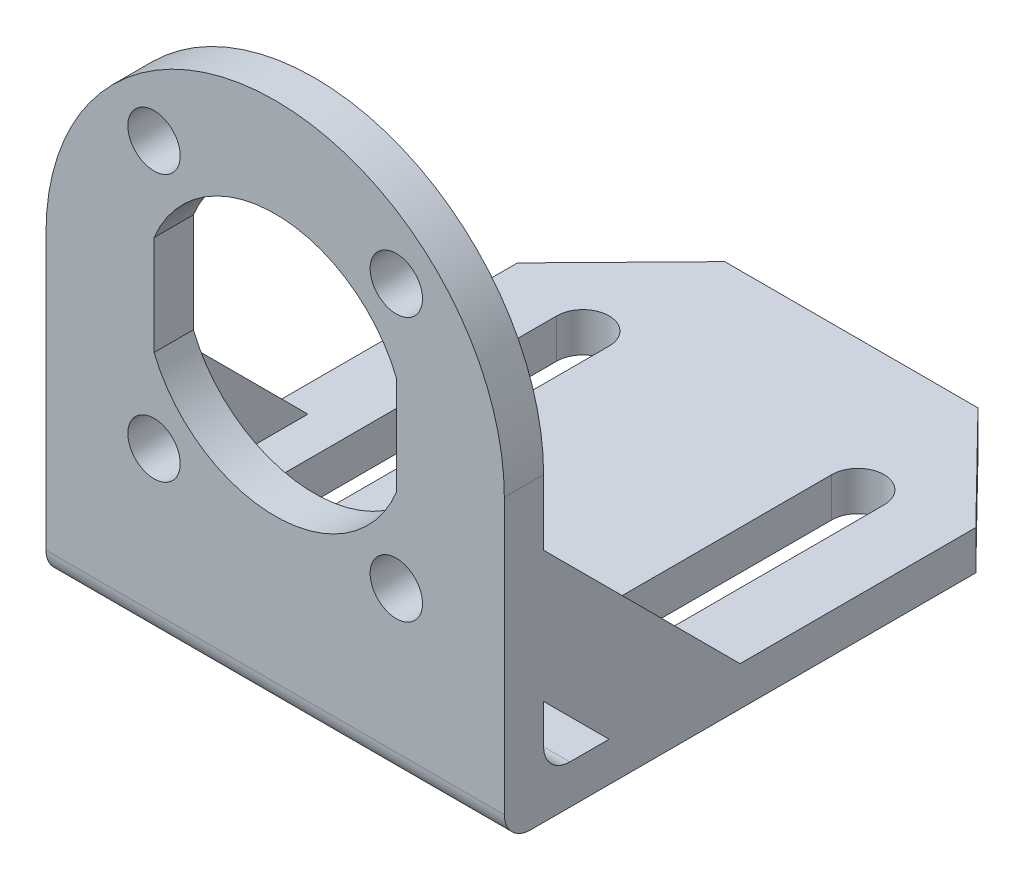
ISO-10303-21;
HEADER;
FILE_DESCRIPTION(('STEP AP214'),'2;1');
FILE_NAME('part.step','',(''),(''),'','','');
FILE_SCHEMA(('AUTOMOTIVE_DESIGN { 1 0 10303 214 1 1 1 1 }'));
ENDSEC;
DATA;
#1=APPLICATION_CONTEXT('core data for automotive mechanical design processes');
#2=APPLICATION_PROTOCOL_DEFINITION('international standard','automotive_design',2000,#1);
#3=PRODUCT_CONTEXT('',#1,'mechanical');
#4=PRODUCT('Part','Part','',(#3));
#5=PRODUCT_RELATED_PRODUCT_CATEGORY('part','',(#4));
#6=PRODUCT_DEFINITION_FORMATION('','',#4);
#7=PRODUCT_DEFINITION_CONTEXT('part definition',#1,'design');
#8=PRODUCT_DEFINITION('design','',#6,#7);
#9=PRODUCT_DEFINITION_SHAPE('','',#8);
#10=(LENGTH_UNIT() NAMED_UNIT(*) SI_UNIT(.MILLI.,.METRE.));
#11=(NAMED_UNIT(*) PLANE_ANGLE_UNIT() SI_UNIT($,.RADIAN.));
#12=(NAMED_UNIT(*) SI_UNIT($,.STERADIAN.) SOLID_ANGLE_UNIT());
#13=UNCERTAINTY_MEASURE_WITH_UNIT(LENGTH_MEASURE(1.E-05),#10,'distance_accuracy_value','');
#14=(GEOMETRIC_REPRESENTATION_CONTEXT(3) GLOBAL_UNCERTAINTY_ASSIGNED_CONTEXT((#13)) GLOBAL_UNIT_ASSIGNED_CONTEXT((#10,
#11,#12)) REPRESENTATION_CONTEXT('',''));
#15=CARTESIAN_POINT('',(0.,0.,0.));
#16=DIRECTION('',(0.,0.,1.));
#17=DIRECTION('',(1.,0.,0.));
#18=AXIS2_PLACEMENT_3D('',#15,#16,#17);
#19=CARTESIAN_POINT('',(17.5,20.,-1.5));
#20=DIRECTION('',(0.,0.,1.));
#21=DIRECTION('',(1.,0.,0.));
#22=AXIS2_PLACEMENT_3D('',#19,#20,#21);
#23=PLANE('',#22);
#24=CARTESIAN_POINT('',(26.7499999999999,9.85000000000002,-1.5));
#25=DIRECTION('',(0.,0.,1.));
#26=DIRECTION('',(1.,0.,0.));
#27=AXIS2_PLACEMENT_3D('',#24,#25,#26);
#28=CIRCLE('',#27,2.);
#29=CARTESIAN_POINT('',(28.75,9.85000000000002,-1.5));
#30=VERTEX_POINT('',#29);
#31=EDGE_CURVE('E274',#30,#30,#28,.T.);
#32=ORIENTED_EDGE('',*,*,#31,.T.);
#33=EDGE_LOOP('',(#32));
#34=FACE_BOUND('',#33,.T.);
#35=CARTESIAN_POINT('',(8.24999999999995,9.85000000000002,-1.5));
#36=DIRECTION('',(0.,0.,1.));
#37=DIRECTION('',(1.,0.,0.));
#38=AXIS2_PLACEMENT_3D('',#35,#36,#37);
#39=CIRCLE('',#38,2.);
#40=CARTESIAN_POINT('',(10.25,9.85000000000002,-1.5));
#41=VERTEX_POINT('',#40);
#42=EDGE_CURVE('E273',#41,#41,#39,.T.);
#43=ORIENTED_EDGE('',*,*,#42,.T.);
#44=EDGE_LOOP('',(#43));
#45=FACE_BOUND('',#44,.T.);
#46=CARTESIAN_POINT('',(26.75,30.,-1.5));
#47=DIRECTION('',(0.,0.,1.));
#48=DIRECTION('',(1.,0.,0.));
#49=AXIS2_PLACEMENT_3D('',#46,#47,#48);
#50=CIRCLE('',#49,2.);
#51=CARTESIAN_POINT('',(28.75,30.,-1.5));
#52=VERTEX_POINT('',#51);
#53=EDGE_CURVE('E281',#52,#52,#50,.T.);
#54=ORIENTED_EDGE('',*,*,#53,.T.);
#55=EDGE_LOOP('',(#54));
#56=FACE_BOUND('',#55,.T.);
#57=CARTESIAN_POINT('',(8.24996261537656,30.2018234548117,-1.5));
#58=DIRECTION('',(0.,0.,1.));
#59=DIRECTION('',(1.,0.,0.));
#60=AXIS2_PLACEMENT_3D('',#57,#58,#59);
#61=CIRCLE('',#60,2.);
#62=CARTESIAN_POINT('',(10.2499626153766,30.2018234548117,-1.5));
#63=VERTEX_POINT('',#62);
#64=EDGE_CURVE('E287',#63,#63,#61,.T.);
#65=ORIENTED_EDGE('',*,*,#64,.T.);
#66=EDGE_LOOP('',(#65));
#67=FACE_BOUND('',#66,.T.);
#68=CARTESIAN_POINT('',(17.5,20.,-1.5));
#69=DIRECTION('',(0.,0.,1.));
#70=DIRECTION('',(-1.,0.,0.));
#71=AXIS2_PLACEMENT_3D('',#68,#69,#70);
#72=CIRCLE('',#71,10.);
#73=CARTESIAN_POINT('',(26.75,23.7996710383927,-1.5));
#74=VERTEX_POINT('',#73);
#75=CARTESIAN_POINT('',(8.24999999999995,23.7996710383927,-1.5));
#76=VERTEX_POINT('',#75);
#77=EDGE_CURVE('E293',#74,#76,#72,.T.);
#78=ORIENTED_EDGE('',*,*,#77,.T.);
#79=DIRECTION('',(0.,-1.,0.));
#80=VECTOR('',#79,1.);
#81=CARTESIAN_POINT('',(8.24999999999995,23.7996710383927,-1.5));
#82=LINE('',#81,#80);
#83=CARTESIAN_POINT('',(8.24999999999995,16.2003289616073,-1.5));
#84=VERTEX_POINT('',#83);
#85=EDGE_CURVE('E309',#76,#84,#82,.T.);
#86=ORIENTED_EDGE('',*,*,#85,.T.);
#87=CARTESIAN_POINT('',(17.5,20.,-1.5));
#88=DIRECTION('',(0.,0.,1.));
#89=DIRECTION('',(1.,0.,0.));
#90=AXIS2_PLACEMENT_3D('',#87,#88,#89);
#91=CIRCLE('',#90,10.);
#92=CARTESIAN_POINT('',(26.75,16.2003289616073,-1.5));
#93=VERTEX_POINT('',#92);
#94=EDGE_CURVE('E312',#84,#93,#91,.T.);
#95=ORIENTED_EDGE('',*,*,#94,.T.);
#96=DIRECTION('',(0.,1.,0.));
#97=VECTOR('',#96,1.);
#98=CARTESIAN_POINT('',(26.75,23.7996710383927,-1.5));
#99=LINE('',#98,#97);
#100=EDGE_CURVE('E299',#93,#74,#99,.T.);
#101=ORIENTED_EDGE('',*,*,#100,.T.);
#102=EDGE_LOOP('',(#78,#86,#95,#101));
#103=FACE_BOUND('',#102,.T.);
#104=DIRECTION('',(0.,1.,0.));
#105=VECTOR('',#104,1.);
#106=CARTESIAN_POINT('',(35.,0.,-1.5));
#107=LINE('',#106,#105);
#108=CARTESIAN_POINT('',(35.,2.,-1.5));
#109=VERTEX_POINT('',#108);
#110=CARTESIAN_POINT('',(35.,5.,-1.5));
#111=VERTEX_POINT('',#110);
#112=EDGE_CURVE('E340',#109,#111,#107,.T.);
#113=ORIENTED_EDGE('',*,*,#112,.F.);
#114=DIRECTION('',(1.,0.,0.));
#115=VECTOR('',#114,1.);
#116=CARTESIAN_POINT('',(17.5,2.,-1.5));
#117=LINE('',#116,#115);
#118=CARTESIAN_POINT('',(0.,2.,-1.5));
#119=VERTEX_POINT('',#118);
#120=EDGE_CURVE('E351',#109,#119,#117,.F.);
#121=ORIENTED_EDGE('',*,*,#120,.T.);
#122=DIRECTION('',(0.,-1.,0.));
#123=VECTOR('',#122,1.);
#124=CARTESIAN_POINT('',(0.,20.,-1.5));
#125=LINE('',#124,#123);
#126=CARTESIAN_POINT('',(0.,5.,-1.5));
#127=VERTEX_POINT('',#126);
#128=EDGE_CURVE('E326',#127,#119,#125,.T.);
#129=ORIENTED_EDGE('',*,*,#128,.F.);
#130=DIRECTION('',(-1.,0.,0.));
#131=VECTOR('',#130,1.);
#132=CARTESIAN_POINT('',(2.00000000000002,4.99999999999999,-1.5));
#133=LINE('',#132,#131);
#134=CARTESIAN_POINT('',(2.00000000000002,4.99999999999999,-1.5));
#135=VERTEX_POINT('',#134);
#136=EDGE_CURVE('E420',#135,#127,#133,.T.);
#137=ORIENTED_EDGE('',*,*,#136,.F.);
#138=DIRECTION('',(0.,-1.,0.));
#139=VECTOR('',#138,1.);
#140=CARTESIAN_POINT('',(2.00000000000007,15.,-1.5));
#141=LINE('',#140,#139);
#142=CARTESIAN_POINT('',(2.00000000000007,15.,-1.5));
#143=VERTEX_POINT('',#142);
#144=EDGE_CURVE('E418',#143,#135,#141,.T.);
#145=ORIENTED_EDGE('',*,*,#144,.F.);
#146=DIRECTION('',(-1.,0.,0.));
#147=VECTOR('',#146,1.);
#148=CARTESIAN_POINT('',(2.00000000000007,15.,-1.5));
#149=LINE('',#148,#147);
#150=CARTESIAN_POINT('',(0.,15.,-1.5));
#151=VERTEX_POINT('',#150);
#152=EDGE_CURVE('E406',#143,#151,#149,.T.);
#153=ORIENTED_EDGE('',*,*,#152,.T.);
#154=CARTESIAN_POINT('',(0.,20.,-1.5));
#155=VERTEX_POINT('',#154);
#156=EDGE_CURVE('E336',#155,#151,#125,.T.);
#157=ORIENTED_EDGE('',*,*,#156,.F.);
#158=CARTESIAN_POINT('',(17.5,20.,-1.5));
#159=DIRECTION('',(0.,0.,1.));
#160=DIRECTION('',(1.,0.,0.));
#161=AXIS2_PLACEMENT_3D('',#158,#159,#160);
#162=CIRCLE('',#161,17.5);
#163=CARTESIAN_POINT('',(34.9999999999999,20.0000000000001,-1.5));
#164=VERTEX_POINT('',#163);
#165=EDGE_CURVE('E331',#164,#155,#162,.T.);
#166=ORIENTED_EDGE('',*,*,#165,.F.);
#167=CARTESIAN_POINT('',(34.9999999999999,15.,-1.5));
#168=VERTEX_POINT('',#167);
#169=EDGE_CURVE('E339',#168,#164,#107,.T.);
#170=ORIENTED_EDGE('',*,*,#169,.F.);
#171=DIRECTION('',(1.,0.,0.));
#172=VECTOR('',#171,1.);
#173=CARTESIAN_POINT('',(32.9999999999999,15.,-1.5));
#174=LINE('',#173,#172);
#175=CARTESIAN_POINT('',(32.9999999999999,15.,-1.5));
#176=VERTEX_POINT('',#175);
#177=EDGE_CURVE('E391',#176,#168,#174,.T.);
#178=ORIENTED_EDGE('',*,*,#177,.F.);
#179=DIRECTION('',(0.,-1.,0.));
#180=VECTOR('',#179,1.);
#181=CARTESIAN_POINT('',(32.9999999999999,15.,-1.5));
#182=LINE('',#181,#180);
#183=CARTESIAN_POINT('',(33.,4.99999999999999,-1.5));
#184=VERTEX_POINT('',#183);
#185=EDGE_CURVE('E411',#176,#184,#182,.T.);
#186=ORIENTED_EDGE('',*,*,#185,.T.);
#187=DIRECTION('',(1.,0.,0.));
#188=VECTOR('',#187,1.);
#189=CARTESIAN_POINT('',(33.,4.99999999999999,-1.5));
#190=LINE('',#189,#188);
#191=EDGE_CURVE('E371',#184,#111,#190,.T.);
#192=ORIENTED_EDGE('',*,*,#191,.T.);
#193=EDGE_LOOP('',(#113,#121,#129,#137,#145,#153,#157,#166,#170,#178,#186,#192));
#194=FACE_BOUND('',#193,.T.);
#195=ADVANCED_FACE('F43',(#34,#45,#56,#67,#103,#194),#23,.F.);
#196=CARTESIAN_POINT('',(0.,0.,-42.5));
#197=DIRECTION('',(0.,1.,0.));
#198=DIRECTION('',(0.,0.,1.));
#199=AXIS2_PLACEMENT_3D('',#196,#197,#198);
#200=PLANE('',#199);
#201=DIRECTION('',(0.,0.,1.));
#202=VECTOR('',#201,1.);
#203=CARTESIAN_POINT('',(0.,0.,-42.5));
#204=LINE('',#203,#202);
#205=CARTESIAN_POINT('',(0.,0.,-6.5));
#206=VERTEX_POINT('',#205);
#207=CARTESIAN_POINT('',(0.,0.,-3.5));
#208=VERTEX_POINT('',#207);
#209=EDGE_CURVE('E378',#206,#208,#204,.T.);
#210=ORIENTED_EDGE('',*,*,#209,.T.);
#211=DIRECTION('',(1.,0.,0.));
#212=VECTOR('',#211,1.);
#213=CARTESIAN_POINT('',(0.,0.,-3.5));
#214=LINE('',#213,#212);
#215=CARTESIAN_POINT('',(35.,0.,-3.5));
#216=VERTEX_POINT('',#215);
#217=EDGE_CURVE('E348',#208,#216,#214,.T.);
#218=ORIENTED_EDGE('',*,*,#217,.T.);
#219=DIRECTION('',(0.,0.,1.));
#220=VECTOR('',#219,1.);
#221=CARTESIAN_POINT('',(35.,0.,-42.5));
#222=LINE('',#221,#220);
#223=CARTESIAN_POINT('',(35.,0.,-6.5));
#224=VERTEX_POINT('',#223);
#225=EDGE_CURVE('E260',#224,#216,#222,.T.);
#226=ORIENTED_EDGE('',*,*,#225,.F.);
#227=DIRECTION('',(1.,0.,0.));
#228=VECTOR('',#227,1.);
#229=CARTESIAN_POINT('',(33.,0.,-6.5));
#230=LINE('',#229,#228);
#231=CARTESIAN_POINT('',(33.,0.,-6.5));
#232=VERTEX_POINT('',#231);
#233=EDGE_CURVE('E396',#232,#224,#230,.T.);
#234=ORIENTED_EDGE('',*,*,#233,.F.);
#235=DIRECTION('',(0.,0.,-1.));
#236=VECTOR('',#235,1.);
#237=CARTESIAN_POINT('',(33.,0.,-6.5));
#238=LINE('',#237,#236);
#239=CARTESIAN_POINT('',(33.,0.,-16.5));
#240=VERTEX_POINT('',#239);
#241=EDGE_CURVE('E394',#232,#240,#238,.T.);
#242=ORIENTED_EDGE('',*,*,#241,.T.);
#243=DIRECTION('',(1.,0.,0.));
#244=VECTOR('',#243,1.);
#245=CARTESIAN_POINT('',(33.,0.,-16.5));
#246=LINE('',#245,#244);
#247=CARTESIAN_POINT('',(35.,0.,-16.5));
#248=VERTEX_POINT('',#247);
#249=EDGE_CURVE('E390',#240,#248,#246,.T.);
#250=ORIENTED_EDGE('',*,*,#249,.T.);
#251=CARTESIAN_POINT('',(35.,0.,-34.5));
#252=VERTEX_POINT('',#251);
#253=EDGE_CURVE('E264',#252,#248,#222,.T.);
#254=ORIENTED_EDGE('',*,*,#253,.F.);
#255=DIRECTION('',(0.699472755302858,0.,0.71465926467725));
#256=VECTOR('',#255,1.);
#257=CARTESIAN_POINT('',(35.1218468919606,0.,-34.3755076455064));
#258=LINE('',#257,#256);
#259=CARTESIAN_POINT('',(27.17,0.,-42.5));
#260=VERTEX_POINT('',#259);
#261=EDGE_CURVE('E246',#260,#252,#258,.T.);
#262=ORIENTED_EDGE('',*,*,#261,.F.);
#263=DIRECTION('',(-1.,0.,0.));
#264=VECTOR('',#263,1.);
#265=CARTESIAN_POINT('',(0.,0.,-42.5));
#266=LINE('',#265,#264);
#267=CARTESIAN_POINT('',(7.83,0.,-42.5));
#268=VERTEX_POINT('',#267);
#269=EDGE_CURVE('E266',#260,#268,#266,.T.);
#270=ORIENTED_EDGE('',*,*,#269,.T.);
#271=DIRECTION('',(0.699472755302858,0.,-0.71465926467725));
#272=VECTOR('',#271,1.);
#273=CARTESIAN_POINT('',(-17.2460216313446,0.,-16.8795436716785));
#274=LINE('',#273,#272);
#275=CARTESIAN_POINT('',(0.,0.,-34.5));
#276=VERTEX_POINT('',#275);
#277=EDGE_CURVE('E477',#276,#268,#274,.T.);
#278=ORIENTED_EDGE('',*,*,#277,.F.);
#279=CARTESIAN_POINT('',(0.,0.,-16.5));
#280=VERTEX_POINT('',#279);
#281=EDGE_CURVE('E277',#276,#280,#204,.T.);
#282=ORIENTED_EDGE('',*,*,#281,.T.);
#283=DIRECTION('',(-1.,0.,0.));
#284=VECTOR('',#283,1.);
#285=CARTESIAN_POINT('',(2.,0.,-16.5));
#286=LINE('',#285,#284);
#287=CARTESIAN_POINT('',(2.,0.,-16.5));
#288=VERTEX_POINT('',#287);
#289=EDGE_CURVE('E415',#288,#280,#286,.T.);
#290=ORIENTED_EDGE('',*,*,#289,.F.);
#291=DIRECTION('',(0.,0.,-1.));
#292=VECTOR('',#291,1.);
#293=CARTESIAN_POINT('',(2.,0.,-6.5));
#294=LINE('',#293,#292);
#295=CARTESIAN_POINT('',(2.,0.,-6.49999999999999));
#296=VERTEX_POINT('',#295);
#297=EDGE_CURVE('E435',#296,#288,#294,.T.);
#298=ORIENTED_EDGE('',*,*,#297,.F.);
#299=DIRECTION('',(-1.,0.,0.));
#300=VECTOR('',#299,1.);
#301=CARTESIAN_POINT('',(2.,0.,-6.5));
#302=LINE('',#301,#300);
#303=EDGE_CURVE('E384',#296,#206,#302,.T.);
#304=ORIENTED_EDGE('',*,*,#303,.T.);
#305=EDGE_LOOP('',(#210,#218,#226,#234,#242,#250,#254,#262,#270,#278,#282,#290,#298,#304));
#306=FACE_BOUND('',#305,.T.);
#307=DIRECTION('',(0.,0.,1.));
#308=VECTOR('',#307,1.);
#309=CARTESIAN_POINT('',(26.,0.,0.));
#310=LINE('',#309,#308);
#311=CARTESIAN_POINT('',(26.,0.,-32.5));
#312=VERTEX_POINT('',#311);
#313=CARTESIAN_POINT('',(26.,0.,-10.5));
#314=VERTEX_POINT('',#313);
#315=EDGE_CURVE('E248',#312,#314,#310,.T.);
#316=ORIENTED_EDGE('',*,*,#315,.F.);
#317=CARTESIAN_POINT('',(28.,0.,-32.5));
#318=DIRECTION('',(0.,1.,0.));
#319=DIRECTION('',(0.,0.,1.));
#320=AXIS2_PLACEMENT_3D('',#317,#318,#319);
#321=CIRCLE('',#320,1.99999999999999);
#322=CARTESIAN_POINT('',(30.,0.,-32.5));
#323=VERTEX_POINT('',#322);
#324=EDGE_CURVE('E489',#323,#312,#321,.T.);
#325=ORIENTED_EDGE('',*,*,#324,.F.);
#326=DIRECTION('',(0.,0.,1.));
#327=VECTOR('',#326,1.);
#328=CARTESIAN_POINT('',(30.,0.,0.));
#329=LINE('',#328,#327);
#330=CARTESIAN_POINT('',(30.,0.,-10.5));
#331=VERTEX_POINT('',#330);
#332=EDGE_CURVE('E493',#323,#331,#329,.T.);
#333=ORIENTED_EDGE('',*,*,#332,.T.);
#334=CARTESIAN_POINT('',(28.,0.,-10.5));
#335=DIRECTION('',(0.,1.,0.));
#336=DIRECTION('',(0.,0.,1.));
#337=AXIS2_PLACEMENT_3D('',#334,#335,#336);
#338=CIRCLE('',#337,2.);
#339=EDGE_CURVE('E496',#314,#331,#338,.T.);
#340=ORIENTED_EDGE('',*,*,#339,.F.);
#341=EDGE_LOOP('',(#316,#325,#333,#340));
#342=FACE_BOUND('',#341,.T.);
#343=DIRECTION('',(0.,0.,1.));
#344=VECTOR('',#343,1.);
#345=CARTESIAN_POINT('',(5.,0.,0.));
#346=LINE('',#345,#344);
#347=CARTESIAN_POINT('',(5.,0.,-32.5));
#348=VERTEX_POINT('',#347);
#349=CARTESIAN_POINT('',(5.,0.,-10.5));
#350=VERTEX_POINT('',#349);
#351=EDGE_CURVE('E458',#348,#350,#346,.T.);
#352=ORIENTED_EDGE('',*,*,#351,.F.);
#353=CARTESIAN_POINT('',(7.,0.,-32.5));
#354=DIRECTION('',(0.,1.,0.));
#355=DIRECTION('',(0.,0.,1.));
#356=AXIS2_PLACEMENT_3D('',#353,#354,#355);
#357=CIRCLE('',#356,2.);
#358=CARTESIAN_POINT('',(9.,0.,-32.5));
#359=VERTEX_POINT('',#358);
#360=EDGE_CURVE('E448',#359,#348,#357,.T.);
#361=ORIENTED_EDGE('',*,*,#360,.F.);
#362=DIRECTION('',(0.,0.,1.));
#363=VECTOR('',#362,1.);
#364=CARTESIAN_POINT('',(8.99999999999999,0.,0.));
#365=LINE('',#364,#363);
#366=CARTESIAN_POINT('',(8.99999999999999,0.,-10.5));
#367=VERTEX_POINT('',#366);
#368=EDGE_CURVE('E452',#359,#367,#365,.T.);
#369=ORIENTED_EDGE('',*,*,#368,.T.);
#370=CARTESIAN_POINT('',(6.99999999999999,0.,-10.5));
#371=DIRECTION('',(0.,1.,0.));
#372=DIRECTION('',(0.,0.,1.));
#373=AXIS2_PLACEMENT_3D('',#370,#371,#372);
#374=CIRCLE('',#373,2.);
#375=EDGE_CURVE('E455',#350,#367,#374,.T.);
#376=ORIENTED_EDGE('',*,*,#375,.F.);
#377=EDGE_LOOP('',(#352,#361,#369,#376));
#378=FACE_BOUND('',#377,.T.);
#379=ADVANCED_FACE('F381',(#306,#342,#378),#200,.T.);
#380=CARTESIAN_POINT('',(17.5,20.,1.5));
#381=DIRECTION('',(0.,0.,1.));
#382=DIRECTION('',(1.,0.,0.));
#383=AXIS2_PLACEMENT_3D('',#380,#381,#382);
#384=PLANE('',#383);
#385=CARTESIAN_POINT('',(8.24999999999995,9.85000000000002,1.5));
#386=DIRECTION('',(0.,0.,1.));
#387=DIRECTION('',(1.,0.,0.));
#388=AXIS2_PLACEMENT_3D('',#385,#386,#387);
#389=CIRCLE('',#388,2.);
#390=CARTESIAN_POINT('',(10.25,9.85000000000002,1.5));
#391=VERTEX_POINT('',#390);
#392=EDGE_CURVE('E278',#391,#391,#389,.T.);
#393=ORIENTED_EDGE('',*,*,#392,.F.);
#394=EDGE_LOOP('',(#393));
#395=FACE_BOUND('',#394,.T.);
#396=CARTESIAN_POINT('',(8.24996261537656,30.2018234548117,1.5));
#397=DIRECTION('',(0.,0.,1.));
#398=DIRECTION('',(1.,0.,0.));
#399=AXIS2_PLACEMENT_3D('',#396,#397,#398);
#400=CIRCLE('',#399,2.);
#401=CARTESIAN_POINT('',(10.2499626153766,30.2018234548117,1.5));
#402=VERTEX_POINT('',#401);
#403=EDGE_CURVE('E290',#402,#402,#400,.T.);
#404=ORIENTED_EDGE('',*,*,#403,.F.);
#405=EDGE_LOOP('',(#404));
#406=FACE_BOUND('',#405,.T.);
#407=DIRECTION('',(0.,-1.,0.));
#408=VECTOR('',#407,1.);
#409=CARTESIAN_POINT('',(0.,20.,1.5));
#410=LINE('',#409,#408);
#411=CARTESIAN_POINT('',(0.,20.,1.5));
#412=VERTEX_POINT('',#411);
#413=CARTESIAN_POINT('',(0.,-1.,1.5));
#414=VERTEX_POINT('',#413);
#415=EDGE_CURVE('E327',#412,#414,#410,.T.);
#416=ORIENTED_EDGE('',*,*,#415,.T.);
#417=DIRECTION('',(1.,0.,0.));
#418=VECTOR('',#417,1.);
#419=CARTESIAN_POINT('',(17.5,-0.999999999999997,1.5));
#420=LINE('',#419,#418);
#421=CARTESIAN_POINT('',(35.,-0.999999999999995,1.5));
#422=VERTEX_POINT('',#421);
#423=EDGE_CURVE('E353',#414,#422,#420,.T.);
#424=ORIENTED_EDGE('',*,*,#423,.T.);
#425=DIRECTION('',(0.,1.,0.));
#426=VECTOR('',#425,1.);
#427=CARTESIAN_POINT('',(35.,0.,1.5));
#428=LINE('',#427,#426);
#429=CARTESIAN_POINT('',(34.9999999999999,20.0000000000001,1.5));
#430=VERTEX_POINT('',#429);
#431=EDGE_CURVE('E330',#422,#430,#428,.T.);
#432=ORIENTED_EDGE('',*,*,#431,.T.);
#433=CARTESIAN_POINT('',(17.5,20.,1.5));
#434=DIRECTION('',(0.,0.,1.));
#435=DIRECTION('',(1.,0.,0.));
#436=AXIS2_PLACEMENT_3D('',#433,#434,#435);
#437=CIRCLE('',#436,17.5);
#438=EDGE_CURVE('E333',#430,#412,#437,.T.);
#439=ORIENTED_EDGE('',*,*,#438,.T.);
#440=EDGE_LOOP('',(#416,#424,#432,#439));
#441=FACE_BOUND('',#440,.T.);
#442=DIRECTION('',(0.,-1.,0.));
#443=VECTOR('',#442,1.);
#444=CARTESIAN_POINT('',(8.24999999999995,23.7996710383927,1.5));
#445=LINE('',#444,#443);
#446=CARTESIAN_POINT('',(8.24999999999995,23.7996710383927,1.5));
#447=VERTEX_POINT('',#446);
#448=CARTESIAN_POINT('',(8.24999999999995,16.2003289616073,1.5));
#449=VERTEX_POINT('',#448);
#450=EDGE_CURVE('E298',#447,#449,#445,.T.);
#451=ORIENTED_EDGE('',*,*,#450,.F.);
#452=CARTESIAN_POINT('',(17.5,20.,1.5));
#453=DIRECTION('',(0.,0.,1.));
#454=DIRECTION('',(-1.,0.,0.));
#455=AXIS2_PLACEMENT_3D('',#452,#453,#454);
#456=CIRCLE('',#455,10.);
#457=CARTESIAN_POINT('',(26.75,23.7996710383927,1.5));
#458=VERTEX_POINT('',#457);
#459=EDGE_CURVE('E296',#458,#447,#456,.T.);
#460=ORIENTED_EDGE('',*,*,#459,.F.);
#461=DIRECTION('',(0.,1.,0.));
#462=VECTOR('',#461,1.);
#463=CARTESIAN_POINT('',(26.75,23.7996710383927,1.5));
#464=LINE('',#463,#462);
#465=CARTESIAN_POINT('',(26.75,16.2003289616073,1.5));
#466=VERTEX_POINT('',#465);
#467=EDGE_CURVE('E304',#466,#458,#464,.T.);
#468=ORIENTED_EDGE('',*,*,#467,.F.);
#469=CARTESIAN_POINT('',(17.5,20.,1.5));
#470=DIRECTION('',(0.,0.,1.));
#471=DIRECTION('',(1.,0.,0.));
#472=AXIS2_PLACEMENT_3D('',#469,#470,#471);
#473=CIRCLE('',#472,10.);
#474=EDGE_CURVE('E301',#449,#466,#473,.T.);
#475=ORIENTED_EDGE('',*,*,#474,.F.);
#476=EDGE_LOOP('',(#451,#460,#468,#475));
#477=FACE_BOUND('',#476,.T.);
#478=CARTESIAN_POINT('',(26.75,30.,1.5));
#479=DIRECTION('',(0.,0.,1.));
#480=DIRECTION('',(1.,0.,0.));
#481=AXIS2_PLACEMENT_3D('',#478,#479,#480);
#482=CIRCLE('',#481,2.);
#483=CARTESIAN_POINT('',(28.75,30.,1.5));
#484=VERTEX_POINT('',#483);
#485=EDGE_CURVE('E284',#484,#484,#482,.T.);
#486=ORIENTED_EDGE('',*,*,#485,.F.);
#487=EDGE_LOOP('',(#486));
#488=FACE_BOUND('',#487,.T.);
#489=CARTESIAN_POINT('',(26.7499999999999,9.85000000000002,1.5));
#490=DIRECTION('',(0.,0.,1.));
#491=DIRECTION('',(1.,0.,0.));
#492=AXIS2_PLACEMENT_3D('',#489,#490,#491);
#493=CIRCLE('',#492,2.);
#494=CARTESIAN_POINT('',(28.75,9.85000000000002,1.5));
#495=VERTEX_POINT('',#494);
#496=EDGE_CURVE('E270',#495,#495,#493,.T.);
#497=ORIENTED_EDGE('',*,*,#496,.F.);
#498=EDGE_LOOP('',(#497));
#499=FACE_BOUND('',#498,.T.);
#500=ADVANCED_FACE('F524',(#395,#406,#441,#477,#488,#499),#384,.T.);
#501=CARTESIAN_POINT('',(0.,20.,1.5));
#502=DIRECTION('',(1.,0.,0.));
#503=DIRECTION('',(0.,1.,0.));
#504=AXIS2_PLACEMENT_3D('',#501,#502,#503);
#505=PLANE('',#504);
#506=DIRECTION('',(0.,-0.707106781186548,-0.707106781186547));
#507=VECTOR('',#506,1.);
#508=CARTESIAN_POINT('',(0.,5.,-1.5));
#509=LINE('',#508,#507);
#510=EDGE_CURVE('E425',#127,#206,#509,.T.);
#511=ORIENTED_EDGE('',*,*,#510,.F.);
#512=ORIENTED_EDGE('',*,*,#128,.T.);
#513=CARTESIAN_POINT('',(0.,2.,-3.5));
#514=DIRECTION('',(1.,0.,0.));
#515=DIRECTION('',(0.,1.,0.));
#516=AXIS2_PLACEMENT_3D('',#513,#514,#515);
#517=CIRCLE('',#516,2.);
#518=EDGE_CURVE('E11',#119,#208,#517,.T.);
#519=ORIENTED_EDGE('',*,*,#518,.T.);
#520=ORIENTED_EDGE('',*,*,#209,.F.);
#521=EDGE_LOOP('',(#511,#512,#519,#520));
#522=FACE_BOUND('',#521,.T.);
#523=DIRECTION('',(0.,0.,1.));
#524=VECTOR('',#523,1.);
#525=CARTESIAN_POINT('',(0.,-3.,-42.5));
#526=LINE('',#525,#524);
#527=CARTESIAN_POINT('',(0.,-3.,-34.5));
#528=VERTEX_POINT('',#527);
#529=CARTESIAN_POINT('',(0.,-3.,-0.5));
#530=VERTEX_POINT('',#529);
#531=EDGE_CURVE('E261',#528,#530,#526,.T.);
#532=ORIENTED_EDGE('',*,*,#531,.T.);
#533=CARTESIAN_POINT('',(0.,-1.,-0.5));
#534=DIRECTION('',(1.,0.,0.));
#535=DIRECTION('',(0.,1.,0.));
#536=AXIS2_PLACEMENT_3D('',#533,#534,#535);
#537=CIRCLE('',#536,2.);
#538=EDGE_CURVE('E358',#530,#414,#537,.F.);
#539=ORIENTED_EDGE('',*,*,#538,.T.);
#540=ORIENTED_EDGE('',*,*,#415,.F.);
#541=DIRECTION('',(0.,0.,-1.));
#542=VECTOR('',#541,1.);
#543=CARTESIAN_POINT('',(0.,20.,1.5));
#544=LINE('',#543,#542);
#545=EDGE_CURVE('E335',#412,#155,#544,.T.);
#546=ORIENTED_EDGE('',*,*,#545,.T.);
#547=ORIENTED_EDGE('',*,*,#156,.T.);
#548=DIRECTION('',(0.,0.707106781186547,0.707106781186548));
#549=VECTOR('',#548,1.);
#550=CARTESIAN_POINT('',(0.,0.,-16.5));
#551=LINE('',#550,#549);
#552=EDGE_CURVE('E428',#280,#151,#551,.T.);
#553=ORIENTED_EDGE('',*,*,#552,.F.);
#554=ORIENTED_EDGE('',*,*,#281,.F.);
#555=DIRECTION('',(0.,1.,0.));
#556=VECTOR('',#555,1.);
#557=CARTESIAN_POINT('',(0.,-3.,-34.5));
#558=LINE('',#557,#556);
#559=EDGE_CURVE('E471',#528,#276,#558,.T.);
#560=ORIENTED_EDGE('',*,*,#559,.F.);
#561=EDGE_LOOP('',(#532,#539,#540,#546,#547,#553,#554,#560));
#562=FACE_BOUND('',#561,.T.);
#563=ADVANCED_FACE('F376',(#522,#562),#505,.F.);
#564=CARTESIAN_POINT('',(35.,0.,1.5));
#565=DIRECTION('',(-1.,0.,0.));
#566=DIRECTION('',(0.,-1.,0.));
#567=AXIS2_PLACEMENT_3D('',#564,#565,#566);
#568=PLANE('',#567);
#569=ORIENTED_EDGE('',*,*,#225,.T.);
#570=CARTESIAN_POINT('',(35.,2.,-3.5));
#571=DIRECTION('',(-1.,0.,0.));
#572=DIRECTION('',(0.,-1.,0.));
#573=AXIS2_PLACEMENT_3D('',#570,#571,#572);
#574=CIRCLE('',#573,2.);
#575=EDGE_CURVE('E51',#216,#109,#574,.T.);
#576=ORIENTED_EDGE('',*,*,#575,.T.);
#577=ORIENTED_EDGE('',*,*,#112,.T.);
#578=DIRECTION('',(0.,-0.707106781186548,-0.707106781186547));
#579=VECTOR('',#578,1.);
#580=CARTESIAN_POINT('',(35.,5.,-1.5));
#581=LINE('',#580,#579);
#582=EDGE_CURVE('E401',#111,#224,#581,.T.);
#583=ORIENTED_EDGE('',*,*,#582,.T.);
#584=EDGE_LOOP('',(#569,#576,#577,#583));
#585=FACE_BOUND('',#584,.T.);
#586=ORIENTED_EDGE('',*,*,#431,.F.);
#587=CARTESIAN_POINT('',(35.,-0.999999999999995,-0.5));
#588=DIRECTION('',(-1.,0.,0.));
#589=DIRECTION('',(0.,-1.,0.));
#590=AXIS2_PLACEMENT_3D('',#587,#588,#589);
#591=CIRCLE('',#590,2.);
#592=CARTESIAN_POINT('',(35.,-3.,-0.5));
#593=VERTEX_POINT('',#592);
#594=EDGE_CURVE('E66',#422,#593,#591,.F.);
#595=ORIENTED_EDGE('',*,*,#594,.T.);
#596=DIRECTION('',(0.,0.,1.));
#597=VECTOR('',#596,1.);
#598=CARTESIAN_POINT('',(35.,-3.,-42.5));
#599=LINE('',#598,#597);
#600=CARTESIAN_POINT('',(35.,-3.,-34.5));
#601=VERTEX_POINT('',#600);
#602=EDGE_CURVE('E254',#601,#593,#599,.T.);
#603=ORIENTED_EDGE('',*,*,#602,.F.);
#604=DIRECTION('',(0.,1.,0.));
#605=VECTOR('',#604,1.);
#606=CARTESIAN_POINT('',(35.,-3.,-34.5));
#607=LINE('',#606,#605);
#608=EDGE_CURVE('E240',#601,#252,#607,.T.);
#609=ORIENTED_EDGE('',*,*,#608,.T.);
#610=ORIENTED_EDGE('',*,*,#253,.T.);
#611=DIRECTION('',(0.,0.707106781186547,0.707106781186548));
#612=VECTOR('',#611,1.);
#613=CARTESIAN_POINT('',(35.,0.,-16.5));
#614=LINE('',#613,#612);
#615=EDGE_CURVE('E404',#248,#168,#614,.T.);
#616=ORIENTED_EDGE('',*,*,#615,.T.);
#617=ORIENTED_EDGE('',*,*,#169,.T.);
#618=DIRECTION('',(0.,0.,-1.));
#619=VECTOR('',#618,1.);
#620=CARTESIAN_POINT('',(34.9999999999999,20.0000000000001,1.5));
#621=LINE('',#620,#619);
#622=EDGE_CURVE('E345',#430,#164,#621,.T.);
#623=ORIENTED_EDGE('',*,*,#622,.F.);
#624=EDGE_LOOP('',(#586,#595,#603,#609,#610,#616,#617,#623));
#625=FACE_BOUND('',#624,.T.);
#626=ADVANCED_FACE('F259',(#585,#625),#568,.F.);
#627=CARTESIAN_POINT('',(17.5,20.,1.5));
#628=DIRECTION('',(0.,0.,-1.));
#629=DIRECTION('',(-1.,0.,0.));
#630=AXIS2_PLACEMENT_3D('',#627,#628,#629);
#631=CYLINDRICAL_SURFACE('',#630,17.5);
#632=ORIENTED_EDGE('',*,*,#165,.T.);
#633=ORIENTED_EDGE('',*,*,#545,.F.);
#634=ORIENTED_EDGE('',*,*,#438,.F.);
#635=ORIENTED_EDGE('',*,*,#622,.T.);
#636=EDGE_LOOP('',(#632,#633,#634,#635));
#637=FACE_BOUND('',#636,.T.);
#638=ADVANCED_FACE('F532',(#637),#631,.T.);
#639=CARTESIAN_POINT('',(17.5,20.,1.5));
#640=DIRECTION('',(0.,0.,-1.));
#641=DIRECTION('',(-1.,0.,0.));
#642=AXIS2_PLACEMENT_3D('',#639,#640,#641);
#643=CYLINDRICAL_SURFACE('',#642,10.);
#644=ORIENTED_EDGE('',*,*,#77,.F.);
#645=DIRECTION('',(0.,0.,-1.));
#646=VECTOR('',#645,1.);
#647=CARTESIAN_POINT('',(26.75,23.7996710383927,1.5));
#648=LINE('',#647,#646);
#649=EDGE_CURVE('E306',#458,#74,#648,.T.);
#650=ORIENTED_EDGE('',*,*,#649,.F.);
#651=ORIENTED_EDGE('',*,*,#459,.T.);
#652=DIRECTION('',(0.,0.,-1.));
#653=VECTOR('',#652,1.);
#654=CARTESIAN_POINT('',(8.24999999999995,23.7996710383927,1.5));
#655=LINE('',#654,#653);
#656=EDGE_CURVE('E323',#447,#76,#655,.T.);
#657=ORIENTED_EDGE('',*,*,#656,.T.);
#658=EDGE_LOOP('',(#644,#650,#651,#657));
#659=FACE_BOUND('',#658,.T.);
#660=ADVANCED_FACE('F569',(#659),#643,.F.);
#661=CARTESIAN_POINT('',(8.24999999999995,23.7996710383927,1.5));
#662=DIRECTION('',(1.,0.,0.));
#663=DIRECTION('',(0.,0.,-1.));
#664=AXIS2_PLACEMENT_3D('',#661,#662,#663);
#665=PLANE('',#664);
#666=ORIENTED_EDGE('',*,*,#85,.F.);
#667=ORIENTED_EDGE('',*,*,#656,.F.);
#668=ORIENTED_EDGE('',*,*,#450,.T.);
#669=DIRECTION('',(0.,0.,-1.));
#670=VECTOR('',#669,1.);
#671=CARTESIAN_POINT('',(8.24999999999995,16.2003289616073,1.5));
#672=LINE('',#671,#670);
#673=EDGE_CURVE('E321',#449,#84,#672,.T.);
#674=ORIENTED_EDGE('',*,*,#673,.T.);
#675=EDGE_LOOP('',(#666,#667,#668,#674));
#676=FACE_BOUND('',#675,.T.);
#677=ADVANCED_FACE('F653',(#676),#665,.T.);
#678=CARTESIAN_POINT('',(17.5,20.,1.5));
#679=DIRECTION('',(0.,0.,-1.));
#680=DIRECTION('',(-1.,0.,0.));
#681=AXIS2_PLACEMENT_3D('',#678,#679,#680);
#682=CYLINDRICAL_SURFACE('',#681,10.);
#683=ORIENTED_EDGE('',*,*,#94,.F.);
#684=ORIENTED_EDGE('',*,*,#673,.F.);
#685=ORIENTED_EDGE('',*,*,#474,.T.);
#686=DIRECTION('',(0.,0.,-1.));
#687=VECTOR('',#686,1.);
#688=CARTESIAN_POINT('',(26.75,16.2003289616073,1.5));
#689=LINE('',#688,#687);
#690=EDGE_CURVE('E319',#466,#93,#689,.T.);
#691=ORIENTED_EDGE('',*,*,#690,.T.);
#692=EDGE_LOOP('',(#683,#684,#685,#691));
#693=FACE_BOUND('',#692,.T.);
#694=ADVANCED_FACE('F649',(#693),#682,.F.);
#695=CARTESIAN_POINT('',(26.75,23.7996710383927,1.5));
#696=DIRECTION('',(-1.,0.,0.));
#697=DIRECTION('',(0.,0.,1.));
#698=AXIS2_PLACEMENT_3D('',#695,#696,#697);
#699=PLANE('',#698);
#700=ORIENTED_EDGE('',*,*,#100,.F.);
#701=ORIENTED_EDGE('',*,*,#690,.F.);
#702=ORIENTED_EDGE('',*,*,#467,.T.);
#703=ORIENTED_EDGE('',*,*,#649,.T.);
#704=EDGE_LOOP('',(#700,#701,#702,#703));
#705=FACE_BOUND('',#704,.T.);
#706=ADVANCED_FACE('F645',(#705),#699,.T.);
#707=CARTESIAN_POINT('',(8.24996261537656,30.2018234548117,1.5));
#708=DIRECTION('',(0.,0.,-1.));
#709=DIRECTION('',(-1.,0.,0.));
#710=AXIS2_PLACEMENT_3D('',#707,#708,#709);
#711=CYLINDRICAL_SURFACE('',#710,2.);
#712=ORIENTED_EDGE('',*,*,#403,.T.);
#713=EDGE_LOOP('',(#712));
#714=FACE_BOUND('',#713,.T.);
#715=ORIENTED_EDGE('',*,*,#64,.F.);
#716=EDGE_LOOP('',(#715));
#717=FACE_BOUND('',#716,.T.);
#718=ADVANCED_FACE('F641',(#714,#717),#711,.F.);
#719=CARTESIAN_POINT('',(26.75,30.,1.5));
#720=DIRECTION('',(0.,0.,-1.));
#721=DIRECTION('',(-1.,0.,0.));
#722=AXIS2_PLACEMENT_3D('',#719,#720,#721);
#723=CYLINDRICAL_SURFACE('',#722,2.);
#724=ORIENTED_EDGE('',*,*,#485,.T.);
#725=EDGE_LOOP('',(#724));
#726=FACE_BOUND('',#725,.T.);
#727=ORIENTED_EDGE('',*,*,#53,.F.);
#728=EDGE_LOOP('',(#727));
#729=FACE_BOUND('',#728,.T.);
#730=ADVANCED_FACE('F637',(#726,#729),#723,.F.);
#731=CARTESIAN_POINT('',(8.24999999999995,9.85000000000002,1.5));
#732=DIRECTION('',(0.,0.,-1.));
#733=DIRECTION('',(-1.,0.,0.));
#734=AXIS2_PLACEMENT_3D('',#731,#732,#733);
#735=CYLINDRICAL_SURFACE('',#734,2.);
#736=ORIENTED_EDGE('',*,*,#392,.T.);
#737=EDGE_LOOP('',(#736));
#738=FACE_BOUND('',#737,.T.);
#739=ORIENTED_EDGE('',*,*,#42,.F.);
#740=EDGE_LOOP('',(#739));
#741=FACE_BOUND('',#740,.T.);
#742=ADVANCED_FACE('F631',(#738,#741),#735,.F.);
#743=CARTESIAN_POINT('',(26.7499999999999,9.85000000000002,1.5));
#744=DIRECTION('',(0.,0.,-1.));
#745=DIRECTION('',(-1.,0.,0.));
#746=AXIS2_PLACEMENT_3D('',#743,#744,#745);
#747=CYLINDRICAL_SURFACE('',#746,2.);
#748=ORIENTED_EDGE('',*,*,#496,.T.);
#749=EDGE_LOOP('',(#748));
#750=FACE_BOUND('',#749,.T.);
#751=ORIENTED_EDGE('',*,*,#31,.F.);
#752=EDGE_LOOP('',(#751));
#753=FACE_BOUND('',#752,.T.);
#754=ADVANCED_FACE('F623',(#750,#753),#747,.F.);
#755=CARTESIAN_POINT('',(35.,-3.,-42.5));
#756=DIRECTION('',(0.,-1.,0.));
#757=DIRECTION('',(1.,0.,0.));
#758=AXIS2_PLACEMENT_3D('',#755,#756,#757);
#759=PLANE('',#758);
#760=ORIENTED_EDGE('',*,*,#602,.T.);
#761=DIRECTION('',(1.,0.,0.));
#762=VECTOR('',#761,1.);
#763=CARTESIAN_POINT('',(35.,-3.,-0.5));
#764=LINE('',#763,#762);
#765=EDGE_CURVE('E58',#593,#530,#764,.F.);
#766=ORIENTED_EDGE('',*,*,#765,.T.);
#767=ORIENTED_EDGE('',*,*,#531,.F.);
#768=DIRECTION('',(0.699472755302858,0.,-0.71465926467725));
#769=VECTOR('',#768,1.);
#770=CARTESIAN_POINT('',(-17.2460216313446,-3.,-16.8795436716785));
#771=LINE('',#770,#769);
#772=CARTESIAN_POINT('',(7.83,-3.,-42.5));
#773=VERTEX_POINT('',#772);
#774=EDGE_CURVE('E474',#528,#773,#771,.T.);
#775=ORIENTED_EDGE('',*,*,#774,.T.);
#776=DIRECTION('',(1.,0.,0.));
#777=VECTOR('',#776,1.);
#778=CARTESIAN_POINT('',(35.,-3.,-42.5));
#779=LINE('',#778,#777);
#780=CARTESIAN_POINT('',(27.17,-3.,-42.5));
#781=VERTEX_POINT('',#780);
#782=EDGE_CURVE('E257',#773,#781,#779,.T.);
#783=ORIENTED_EDGE('',*,*,#782,.T.);
#784=DIRECTION('',(0.699472755302858,0.,0.71465926467725));
#785=VECTOR('',#784,1.);
#786=CARTESIAN_POINT('',(35.1218468919606,-3.,-34.3755076455064));
#787=LINE('',#786,#785);
#788=EDGE_CURVE('E243',#781,#601,#787,.T.);
#789=ORIENTED_EDGE('',*,*,#788,.T.);
#790=EDGE_LOOP('',(#760,#766,#767,#775,#783,#789));
#791=FACE_BOUND('',#790,.T.);
#792=DIRECTION('',(0.,0.,1.));
#793=VECTOR('',#792,1.);
#794=CARTESIAN_POINT('',(26.,-3.,0.));
#795=LINE('',#794,#793);
#796=CARTESIAN_POINT('',(26.,-3.,-32.5));
#797=VERTEX_POINT('',#796);
#798=CARTESIAN_POINT('',(26.,-3.,-10.5));
#799=VERTEX_POINT('',#798);
#800=EDGE_CURVE('E492',#797,#799,#795,.T.);
#801=ORIENTED_EDGE('',*,*,#800,.T.);
#802=CARTESIAN_POINT('',(28.,-3.,-10.5));
#803=DIRECTION('',(0.,1.,0.));
#804=DIRECTION('',(0.,0.,1.));
#805=AXIS2_PLACEMENT_3D('',#802,#803,#804);
#806=CIRCLE('',#805,2.);
#807=CARTESIAN_POINT('',(30.,-3.,-10.5));
#808=VERTEX_POINT('',#807);
#809=EDGE_CURVE('E505',#799,#808,#806,.T.);
#810=ORIENTED_EDGE('',*,*,#809,.T.);
#811=DIRECTION('',(0.,0.,1.));
#812=VECTOR('',#811,1.);
#813=CARTESIAN_POINT('',(30.,-3.,0.));
#814=LINE('',#813,#812);
#815=CARTESIAN_POINT('',(30.,-3.,-32.5));
#816=VERTEX_POINT('',#815);
#817=EDGE_CURVE('E502',#816,#808,#814,.T.);
#818=ORIENTED_EDGE('',*,*,#817,.F.);
#819=CARTESIAN_POINT('',(28.,-3.,-32.5));
#820=DIRECTION('',(0.,1.,0.));
#821=DIRECTION('',(0.,0.,1.));
#822=AXIS2_PLACEMENT_3D('',#819,#820,#821);
#823=CIRCLE('',#822,1.99999999999999);
#824=EDGE_CURVE('E484',#816,#797,#823,.T.);
#825=ORIENTED_EDGE('',*,*,#824,.T.);
#826=EDGE_LOOP('',(#801,#810,#818,#825));
#827=FACE_BOUND('',#826,.T.);
#828=DIRECTION('',(0.,0.,1.));
#829=VECTOR('',#828,1.);
#830=CARTESIAN_POINT('',(5.,-3.,0.));
#831=LINE('',#830,#829);
#832=CARTESIAN_POINT('',(5.,-3.,-32.5));
#833=VERTEX_POINT('',#832);
#834=CARTESIAN_POINT('',(5.,-3.,-10.5));
#835=VERTEX_POINT('',#834);
#836=EDGE_CURVE('E451',#833,#835,#831,.T.);
#837=ORIENTED_EDGE('',*,*,#836,.T.);
#838=CARTESIAN_POINT('',(6.99999999999999,-3.,-10.5));
#839=DIRECTION('',(0.,1.,0.));
#840=DIRECTION('',(0.,0.,1.));
#841=AXIS2_PLACEMENT_3D('',#838,#839,#840);
#842=CIRCLE('',#841,2.);
#843=CARTESIAN_POINT('',(8.99999999999999,-3.,-10.5));
#844=VERTEX_POINT('',#843);
#845=EDGE_CURVE('E466',#835,#844,#842,.T.);
#846=ORIENTED_EDGE('',*,*,#845,.T.);
#847=DIRECTION('',(0.,0.,1.));
#848=VECTOR('',#847,1.);
#849=CARTESIAN_POINT('',(8.99999999999999,-3.,0.));
#850=LINE('',#849,#848);
#851=CARTESIAN_POINT('',(9.,-3.,-32.5));
#852=VERTEX_POINT('',#851);
#853=EDGE_CURVE('E463',#852,#844,#850,.T.);
#854=ORIENTED_EDGE('',*,*,#853,.F.);
#855=CARTESIAN_POINT('',(7.,-3.,-32.5));
#856=DIRECTION('',(0.,1.,0.));
#857=DIRECTION('',(0.,0.,1.));
#858=AXIS2_PLACEMENT_3D('',#855,#856,#857);
#859=CIRCLE('',#858,2.);
#860=EDGE_CURVE('E443',#852,#833,#859,.T.);
#861=ORIENTED_EDGE('',*,*,#860,.T.);
#862=EDGE_LOOP('',(#837,#846,#854,#861));
#863=FACE_BOUND('',#862,.T.);
#864=ADVANCED_FACE('F252',(#791,#827,#863),#759,.T.);
#865=CARTESIAN_POINT('',(0.,0.,-42.5));
#866=DIRECTION('',(0.,0.,-1.));
#867=DIRECTION('',(-1.,0.,0.));
#868=AXIS2_PLACEMENT_3D('',#865,#866,#867);
#869=PLANE('',#868);
#870=DIRECTION('',(0.,1.,0.));
#871=VECTOR('',#870,1.);
#872=CARTESIAN_POINT('',(7.83,-3.,-42.5));
#873=LINE('',#872,#871);
#874=EDGE_CURVE('E473',#773,#268,#873,.T.);
#875=ORIENTED_EDGE('',*,*,#874,.T.);
#876=ORIENTED_EDGE('',*,*,#269,.F.);
#877=DIRECTION('',(0.,1.,0.));
#878=VECTOR('',#877,1.);
#879=CARTESIAN_POINT('',(27.17,-3.,-42.5));
#880=LINE('',#879,#878);
#881=EDGE_CURVE('E249',#781,#260,#880,.T.);
#882=ORIENTED_EDGE('',*,*,#881,.F.);
#883=ORIENTED_EDGE('',*,*,#782,.F.);
#884=EDGE_LOOP('',(#875,#876,#882,#883));
#885=FACE_BOUND('',#884,.T.);
#886=ADVANCED_FACE('F514',(#885),#869,.T.);
#887=CARTESIAN_POINT('',(33.,0.,-16.5));
#888=DIRECTION('',(0.,0.707106781186548,-0.707106781186547));
#889=DIRECTION('',(0.,0.707106781186547,0.707106781186548));
#890=AXIS2_PLACEMENT_3D('',#887,#888,#889);
#891=PLANE('',#890);
#892=ORIENTED_EDGE('',*,*,#615,.F.);
#893=ORIENTED_EDGE('',*,*,#249,.F.);
#894=DIRECTION('',(0.,0.707106781186547,0.707106781186548));
#895=VECTOR('',#894,1.);
#896=CARTESIAN_POINT('',(33.,0.,-16.5));
#897=LINE('',#896,#895);
#898=EDGE_CURVE('E403',#240,#176,#897,.T.);
#899=ORIENTED_EDGE('',*,*,#898,.T.);
#900=ORIENTED_EDGE('',*,*,#177,.T.);
#901=EDGE_LOOP('',(#892,#893,#899,#900));
#902=FACE_BOUND('',#901,.T.);
#903=ADVANCED_FACE('F628',(#902),#891,.T.);
#904=CARTESIAN_POINT('',(33.,4.99999999999999,-1.5));
#905=DIRECTION('',(0.,-0.707106781186547,0.707106781186548));
#906=DIRECTION('',(0.,-0.707106781186548,-0.707106781186547));
#907=AXIS2_PLACEMENT_3D('',#904,#905,#906);
#908=PLANE('',#907);
#909=ORIENTED_EDGE('',*,*,#582,.F.);
#910=ORIENTED_EDGE('',*,*,#191,.F.);
#911=DIRECTION('',(0.,-0.707106781186548,-0.707106781186547));
#912=VECTOR('',#911,1.);
#913=CARTESIAN_POINT('',(33.,4.99999999999999,-1.5));
#914=LINE('',#913,#912);
#915=EDGE_CURVE('E409',#184,#232,#914,.T.);
#916=ORIENTED_EDGE('',*,*,#915,.T.);
#917=ORIENTED_EDGE('',*,*,#233,.T.);
#918=EDGE_LOOP('',(#909,#910,#916,#917));
#919=FACE_BOUND('',#918,.T.);
#920=ADVANCED_FACE('F723',(#919),#908,.T.);
#921=CARTESIAN_POINT('',(33.,1.60288449180257E-13,0.));
#922=DIRECTION('',(1.,0.,0.));
#923=DIRECTION('',(0.,1.,0.));
#924=AXIS2_PLACEMENT_3D('',#921,#922,#923);
#925=PLANE('',#924);
#926=ORIENTED_EDGE('',*,*,#898,.F.);
#927=ORIENTED_EDGE('',*,*,#241,.F.);
#928=ORIENTED_EDGE('',*,*,#915,.F.);
#929=ORIENTED_EDGE('',*,*,#185,.F.);
#930=EDGE_LOOP('',(#926,#927,#928,#929));
#931=FACE_BOUND('',#930,.T.);
#932=ADVANCED_FACE('F553',(#931),#925,.F.);
#933=CARTESIAN_POINT('',(2.,0.,-16.5));
#934=DIRECTION('',(0.,-0.707106781186548,0.707106781186547));
#935=DIRECTION('',(0.,-0.707106781186547,-0.707106781186548));
#936=AXIS2_PLACEMENT_3D('',#933,#934,#935);
#937=PLANE('',#936);
#938=ORIENTED_EDGE('',*,*,#552,.T.);
#939=ORIENTED_EDGE('',*,*,#152,.F.);
#940=DIRECTION('',(0.,0.707106781186547,0.707106781186548));
#941=VECTOR('',#940,1.);
#942=CARTESIAN_POINT('',(2.,0.,-16.5));
#943=LINE('',#942,#941);
#944=EDGE_CURVE('E427',#288,#143,#943,.T.);
#945=ORIENTED_EDGE('',*,*,#944,.F.);
#946=ORIENTED_EDGE('',*,*,#289,.T.);
#947=EDGE_LOOP('',(#938,#939,#945,#946));
#948=FACE_BOUND('',#947,.T.);
#949=ADVANCED_FACE('F540',(#948),#937,.F.);
#950=CARTESIAN_POINT('',(2.00000000000002,4.99999999999999,-1.5));
#951=DIRECTION('',(0.,0.707106781186547,-0.707106781186548));
#952=DIRECTION('',(0.,0.707106781186548,0.707106781186547));
#953=AXIS2_PLACEMENT_3D('',#950,#951,#952);
#954=PLANE('',#953);
#955=ORIENTED_EDGE('',*,*,#510,.T.);
#956=ORIENTED_EDGE('',*,*,#303,.F.);
#957=DIRECTION('',(0.,-0.707106781186548,-0.707106781186547));
#958=VECTOR('',#957,1.);
#959=CARTESIAN_POINT('',(2.00000000000002,4.99999999999999,-1.5));
#960=LINE('',#959,#958);
#961=EDGE_CURVE('E432',#135,#296,#960,.T.);
#962=ORIENTED_EDGE('',*,*,#961,.F.);
#963=ORIENTED_EDGE('',*,*,#136,.T.);
#964=EDGE_LOOP('',(#955,#956,#962,#963));
#965=FACE_BOUND('',#964,.T.);
#966=ADVANCED_FACE('F545',(#965),#954,.F.);
#967=CARTESIAN_POINT('',(2.,1.60288449180257E-13,0.));
#968=DIRECTION('',(-1.,0.,0.));
#969=DIRECTION('',(0.,1.,0.));
#970=AXIS2_PLACEMENT_3D('',#967,#968,#969);
#971=PLANE('',#970);
#972=ORIENTED_EDGE('',*,*,#944,.T.);
#973=ORIENTED_EDGE('',*,*,#144,.T.);
#974=ORIENTED_EDGE('',*,*,#961,.T.);
#975=ORIENTED_EDGE('',*,*,#297,.T.);
#976=EDGE_LOOP('',(#972,#973,#974,#975));
#977=FACE_BOUND('',#976,.T.);
#978=ADVANCED_FACE('F542',(#977),#971,.F.);
#979=CARTESIAN_POINT('',(35.1218468919606,-3.,-34.3755076455064));
#980=DIRECTION('',(-0.71465926467725,0.,0.699472755302858));
#981=DIRECTION('',(0.699472755302858,0.,0.71465926467725));
#982=AXIS2_PLACEMENT_3D('',#979,#980,#981);
#983=PLANE('',#982);
#984=ORIENTED_EDGE('',*,*,#261,.T.);
#985=ORIENTED_EDGE('',*,*,#608,.F.);
#986=ORIENTED_EDGE('',*,*,#788,.F.);
#987=ORIENTED_EDGE('',*,*,#881,.T.);
#988=EDGE_LOOP('',(#984,#985,#986,#987));
#989=FACE_BOUND('',#988,.T.);
#990=ADVANCED_FACE('F242',(#989),#983,.F.);
#991=CARTESIAN_POINT('',(-17.2460216313446,-3.,-16.8795436716785));
#992=DIRECTION('',(0.71465926467725,0.,0.699472755302858));
#993=DIRECTION('',(0.699472755302858,0.,-0.71465926467725));
#994=AXIS2_PLACEMENT_3D('',#991,#992,#993);
#995=PLANE('',#994);
#996=ORIENTED_EDGE('',*,*,#277,.T.);
#997=ORIENTED_EDGE('',*,*,#874,.F.);
#998=ORIENTED_EDGE('',*,*,#774,.F.);
#999=ORIENTED_EDGE('',*,*,#559,.T.);
#1000=EDGE_LOOP('',(#996,#997,#998,#999));
#1001=FACE_BOUND('',#1000,.T.);
#1002=ADVANCED_FACE('F516',(#1001),#995,.F.);
#1003=CARTESIAN_POINT('',(5.,-3.,0.));
#1004=DIRECTION('',(-1.,0.,0.));
#1005=DIRECTION('',(0.,0.,1.));
#1006=AXIS2_PLACEMENT_3D('',#1003,#1004,#1005);
#1007=PLANE('',#1006);
#1008=ORIENTED_EDGE('',*,*,#351,.T.);
#1009=DIRECTION('',(0.,1.,0.));
#1010=VECTOR('',#1009,1.);
#1011=CARTESIAN_POINT('',(5.,-3.,-10.5));
#1012=LINE('',#1011,#1010);
#1013=EDGE_CURVE('E439',#835,#350,#1012,.T.);
#1014=ORIENTED_EDGE('',*,*,#1013,.F.);
#1015=ORIENTED_EDGE('',*,*,#836,.F.);
#1016=DIRECTION('',(0.,1.,0.));
#1017=VECTOR('',#1016,1.);
#1018=CARTESIAN_POINT('',(5.,-3.,-32.5));
#1019=LINE('',#1018,#1017);
#1020=EDGE_CURVE('E430',#833,#348,#1019,.T.);
#1021=ORIENTED_EDGE('',*,*,#1020,.T.);
#1022=EDGE_LOOP('',(#1008,#1014,#1015,#1021));
#1023=FACE_BOUND('',#1022,.T.);
#1024=ADVANCED_FACE('F597',(#1023),#1007,.F.);
#1025=CARTESIAN_POINT('',(7.,-3.,-32.5));
#1026=DIRECTION('',(0.,1.,0.));
#1027=DIRECTION('',(0.,0.,1.));
#1028=AXIS2_PLACEMENT_3D('',#1025,#1026,#1027);
#1029=CYLINDRICAL_SURFACE('',#1028,2.);
#1030=ORIENTED_EDGE('',*,*,#360,.T.);
#1031=ORIENTED_EDGE('',*,*,#1020,.F.);
#1032=ORIENTED_EDGE('',*,*,#860,.F.);
#1033=DIRECTION('',(0.,1.,0.));
#1034=VECTOR('',#1033,1.);
#1035=CARTESIAN_POINT('',(9.,-3.,-32.5));
#1036=LINE('',#1035,#1034);
#1037=EDGE_CURVE('E445',#852,#359,#1036,.T.);
#1038=ORIENTED_EDGE('',*,*,#1037,.T.);
#1039=EDGE_LOOP('',(#1030,#1031,#1032,#1038));
#1040=FACE_BOUND('',#1039,.T.);
#1041=ADVANCED_FACE('F598',(#1040),#1029,.F.);
#1042=CARTESIAN_POINT('',(8.99999999999999,-3.,0.));
#1043=DIRECTION('',(-1.,0.,0.));
#1044=DIRECTION('',(0.,0.,1.));
#1045=AXIS2_PLACEMENT_3D('',#1042,#1043,#1044);
#1046=PLANE('',#1045);
#1047=ORIENTED_EDGE('',*,*,#368,.F.);
#1048=ORIENTED_EDGE('',*,*,#1037,.F.);
#1049=ORIENTED_EDGE('',*,*,#853,.T.);
#1050=DIRECTION('',(0.,1.,0.));
#1051=VECTOR('',#1050,1.);
#1052=CARTESIAN_POINT('',(8.99999999999999,-3.,-10.5));
#1053=LINE('',#1052,#1051);
#1054=EDGE_CURVE('E442',#844,#367,#1053,.T.);
#1055=ORIENTED_EDGE('',*,*,#1054,.T.);
#1056=EDGE_LOOP('',(#1047,#1048,#1049,#1055));
#1057=FACE_BOUND('',#1056,.T.);
#1058=ADVANCED_FACE('F601',(#1057),#1046,.T.);
#1059=CARTESIAN_POINT('',(6.99999999999999,-3.,-10.5));
#1060=DIRECTION('',(0.,1.,0.));
#1061=DIRECTION('',(0.,0.,1.));
#1062=AXIS2_PLACEMENT_3D('',#1059,#1060,#1061);
#1063=CYLINDRICAL_SURFACE('',#1062,2.);
#1064=ORIENTED_EDGE('',*,*,#375,.T.);
#1065=ORIENTED_EDGE('',*,*,#1054,.F.);
#1066=ORIENTED_EDGE('',*,*,#845,.F.);
#1067=ORIENTED_EDGE('',*,*,#1013,.T.);
#1068=EDGE_LOOP('',(#1064,#1065,#1066,#1067));
#1069=FACE_BOUND('',#1068,.T.);
#1070=ADVANCED_FACE('F593',(#1069),#1063,.F.);
#1071=CARTESIAN_POINT('',(26.,-3.,0.));
#1072=DIRECTION('',(-1.,0.,0.));
#1073=DIRECTION('',(0.,0.,1.));
#1074=AXIS2_PLACEMENT_3D('',#1071,#1072,#1073);
#1075=PLANE('',#1074);
#1076=ORIENTED_EDGE('',*,*,#315,.T.);
#1077=DIRECTION('',(0.,1.,0.));
#1078=VECTOR('',#1077,1.);
#1079=CARTESIAN_POINT('',(26.,-3.,-10.5));
#1080=LINE('',#1079,#1078);
#1081=EDGE_CURVE('E480',#799,#314,#1080,.T.);
#1082=ORIENTED_EDGE('',*,*,#1081,.F.);
#1083=ORIENTED_EDGE('',*,*,#800,.F.);
#1084=DIRECTION('',(0.,1.,0.));
#1085=VECTOR('',#1084,1.);
#1086=CARTESIAN_POINT('',(26.,-3.,-32.5));
#1087=LINE('',#1086,#1085);
#1088=EDGE_CURVE('E460',#797,#312,#1087,.T.);
#1089=ORIENTED_EDGE('',*,*,#1088,.T.);
#1090=EDGE_LOOP('',(#1076,#1082,#1083,#1089));
#1091=FACE_BOUND('',#1090,.T.);
#1092=ADVANCED_FACE('F590',(#1091),#1075,.F.);
#1093=CARTESIAN_POINT('',(28.,-3.,-32.5));
#1094=DIRECTION('',(0.,1.,0.));
#1095=DIRECTION('',(0.,0.,1.));
#1096=AXIS2_PLACEMENT_3D('',#1093,#1094,#1095);
#1097=CYLINDRICAL_SURFACE('',#1096,1.99999999999999);
#1098=ORIENTED_EDGE('',*,*,#324,.T.);
#1099=ORIENTED_EDGE('',*,*,#1088,.F.);
#1100=ORIENTED_EDGE('',*,*,#824,.F.);
#1101=DIRECTION('',(0.,1.,0.));
#1102=VECTOR('',#1101,1.);
#1103=CARTESIAN_POINT('',(30.,-3.,-32.5));
#1104=LINE('',#1103,#1102);
#1105=EDGE_CURVE('E486',#816,#323,#1104,.T.);
#1106=ORIENTED_EDGE('',*,*,#1105,.T.);
#1107=EDGE_LOOP('',(#1098,#1099,#1100,#1106));
#1108=FACE_BOUND('',#1107,.T.);
#1109=ADVANCED_FACE('F585',(#1108),#1097,.F.);
#1110=CARTESIAN_POINT('',(30.,-3.,0.));
#1111=DIRECTION('',(-1.,0.,0.));
#1112=DIRECTION('',(0.,0.,1.));
#1113=AXIS2_PLACEMENT_3D('',#1110,#1111,#1112);
#1114=PLANE('',#1113);
#1115=ORIENTED_EDGE('',*,*,#332,.F.);
#1116=ORIENTED_EDGE('',*,*,#1105,.F.);
#1117=ORIENTED_EDGE('',*,*,#817,.T.);
#1118=DIRECTION('',(0.,1.,0.));
#1119=VECTOR('',#1118,1.);
#1120=CARTESIAN_POINT('',(30.,-3.,-10.5));
#1121=LINE('',#1120,#1119);
#1122=EDGE_CURVE('E483',#808,#331,#1121,.T.);
#1123=ORIENTED_EDGE('',*,*,#1122,.T.);
#1124=EDGE_LOOP('',(#1115,#1116,#1117,#1123));
#1125=FACE_BOUND('',#1124,.T.);
#1126=ADVANCED_FACE('F579',(#1125),#1114,.T.);
#1127=CARTESIAN_POINT('',(28.,-3.,-10.5));
#1128=DIRECTION('',(0.,1.,0.));
#1129=DIRECTION('',(0.,0.,1.));
#1130=AXIS2_PLACEMENT_3D('',#1127,#1128,#1129);
#1131=CYLINDRICAL_SURFACE('',#1130,2.);
#1132=ORIENTED_EDGE('',*,*,#339,.T.);
#1133=ORIENTED_EDGE('',*,*,#1122,.F.);
#1134=ORIENTED_EDGE('',*,*,#809,.F.);
#1135=ORIENTED_EDGE('',*,*,#1081,.T.);
#1136=EDGE_LOOP('',(#1132,#1133,#1134,#1135));
#1137=FACE_BOUND('',#1136,.T.);
#1138=ADVANCED_FACE('F574',(#1137),#1131,.F.);
#1139=CARTESIAN_POINT('',(0.,2.,-3.5));
#1140=DIRECTION('',(1.,0.,0.));
#1141=DIRECTION('',(0.,0.,-1.));
#1142=AXIS2_PLACEMENT_3D('',#1139,#1140,#1141);
#1143=CYLINDRICAL_SURFACE('',#1142,2.);
#1144=ORIENTED_EDGE('',*,*,#518,.F.);
#1145=ORIENTED_EDGE('',*,*,#120,.F.);
#1146=ORIENTED_EDGE('',*,*,#575,.F.);
#1147=ORIENTED_EDGE('',*,*,#217,.F.);
#1148=EDGE_LOOP('',(#1144,#1145,#1146,#1147));
#1149=FACE_BOUND('',#1148,.T.);
#1150=ADVANCED_FACE('F373',(#1149),#1143,.F.);
#1151=CARTESIAN_POINT('',(17.5,-0.999999999999997,-0.5));
#1152=DIRECTION('',(1.,0.,0.));
#1153=DIRECTION('',(0.,1.,0.));
#1154=AXIS2_PLACEMENT_3D('',#1151,#1152,#1153);
#1155=CYLINDRICAL_SURFACE('',#1154,2.);
#1156=ORIENTED_EDGE('',*,*,#538,.F.);
#1157=ORIENTED_EDGE('',*,*,#765,.F.);
#1158=ORIENTED_EDGE('',*,*,#594,.F.);
#1159=ORIENTED_EDGE('',*,*,#423,.F.);
#1160=EDGE_LOOP('',(#1156,#1157,#1158,#1159));
#1161=FACE_BOUND('',#1160,.T.);
#1162=ADVANCED_FACE('F45',(#1161),#1155,.T.);
#1163=CLOSED_SHELL('',(#195,#379,#500,#563,#626,#638,#660,#677,#694,#706,#718,#730,#742,#754,
#864,#886,#903,#920,#932,#949,#966,#978,#990,#1002,#1024,#1041,#1058,#1070,#1092,#1109,#1126,
#1138,#1150,#1162));
#1164=MANIFOLD_SOLID_BREP('B2',#1163);
#1165=ADVANCED_BREP_SHAPE_REPRESENTATION('',(#18,#1164),#14);
#1166=SHAPE_DEFINITION_REPRESENTATION(#9,#1165);
ENDSEC;
END-ISO-10303-21;
